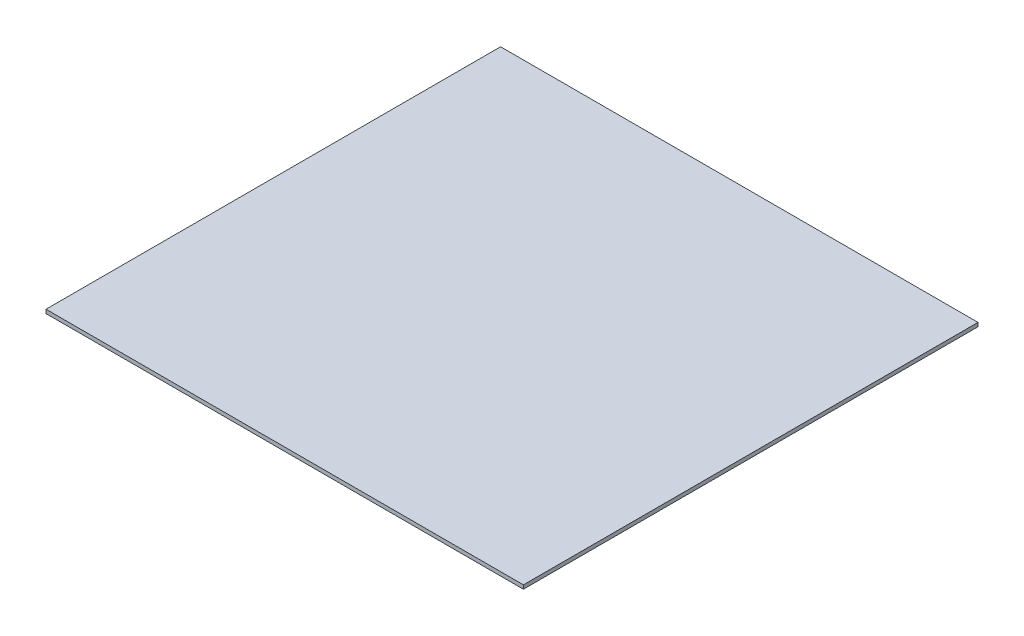
ISO-10303-21;
HEADER;
FILE_DESCRIPTION(('STEP AP214'),'2;1');
FILE_NAME('part.step','',(''),(''),'','','');
FILE_SCHEMA(('AUTOMOTIVE_DESIGN { 1 0 10303 214 1 1 1 1 }'));
ENDSEC;
DATA;
#1=APPLICATION_CONTEXT('core data for automotive mechanical design processes');
#2=APPLICATION_PROTOCOL_DEFINITION('international standard','automotive_design',2000,#1);
#3=PRODUCT_CONTEXT('',#1,'mechanical');
#4=PRODUCT('Part','Part','',(#3));
#5=PRODUCT_RELATED_PRODUCT_CATEGORY('part','',(#4));
#6=PRODUCT_DEFINITION_FORMATION('','',#4);
#7=PRODUCT_DEFINITION_CONTEXT('part definition',#1,'design');
#8=PRODUCT_DEFINITION('design','',#6,#7);
#9=PRODUCT_DEFINITION_SHAPE('','',#8);
#10=(LENGTH_UNIT() NAMED_UNIT(*) SI_UNIT(.MILLI.,.METRE.));
#11=(NAMED_UNIT(*) PLANE_ANGLE_UNIT() SI_UNIT($,.RADIAN.));
#12=(NAMED_UNIT(*) SI_UNIT($,.STERADIAN.) SOLID_ANGLE_UNIT());
#13=UNCERTAINTY_MEASURE_WITH_UNIT(LENGTH_MEASURE(1.E-05),#10,'distance_accuracy_value','');
#14=(GEOMETRIC_REPRESENTATION_CONTEXT(3) GLOBAL_UNCERTAINTY_ASSIGNED_CONTEXT((#13)) GLOBAL_UNIT_ASSIGNED_CONTEXT((#10,
#11,#12)) REPRESENTATION_CONTEXT('',''));
#15=CARTESIAN_POINT('',(0.,0.,0.));
#16=DIRECTION('',(0.,0.,1.));
#17=DIRECTION('',(1.,0.,0.));
#18=AXIS2_PLACEMENT_3D('',#15,#16,#17);
#19=CARTESIAN_POINT('',(-93.0917874396136,2.,-179.682367149758));
#20=DIRECTION('',(1.,0.,0.));
#21=DIRECTION('',(0.,0.,-1.));
#22=AXIS2_PLACEMENT_3D('',#19,#20,#21);
#23=PLANE('',#22);
#24=DIRECTION('',(0.,0.,1.));
#25=VECTOR('',#24,1.);
#26=CARTESIAN_POINT('',(-93.0917874396136,0.,-179.682367149758));
#27=LINE('',#26,#25);
#28=CARTESIAN_POINT('',(-93.0917874396136,0.,-179.682367149758));
#29=VERTEX_POINT('',#28);
#30=CARTESIAN_POINT('',(-93.0917874396135,0.,59.3176328502415));
#31=VERTEX_POINT('',#30);
#32=EDGE_CURVE('E113',#29,#31,#27,.T.);
#33=ORIENTED_EDGE('',*,*,#32,.T.);
#34=DIRECTION('',(0.,-1.,0.));
#35=VECTOR('',#34,1.);
#36=CARTESIAN_POINT('',(-93.0917874396135,2.,59.3176328502415));
#37=LINE('',#36,#35);
#38=CARTESIAN_POINT('',(-93.0917874396135,2.,59.3176328502415));
#39=VERTEX_POINT('',#38);
#40=EDGE_CURVE('E11',#39,#31,#37,.T.);
#41=ORIENTED_EDGE('',*,*,#40,.F.);
#42=DIRECTION('',(0.,0.,1.));
#43=VECTOR('',#42,1.);
#44=CARTESIAN_POINT('',(-93.0917874396136,2.,-179.682367149758));
#45=LINE('',#44,#43);
#46=CARTESIAN_POINT('',(-93.0917874396136,2.,-179.682367149758));
#47=VERTEX_POINT('',#46);
#48=EDGE_CURVE('E97',#47,#39,#45,.T.);
#49=ORIENTED_EDGE('',*,*,#48,.F.);
#50=DIRECTION('',(0.,-1.,0.));
#51=VECTOR('',#50,1.);
#52=CARTESIAN_POINT('',(-93.0917874396136,2.,-179.682367149758));
#53=LINE('',#52,#51);
#54=EDGE_CURVE('E109',#47,#29,#53,.T.);
#55=ORIENTED_EDGE('',*,*,#54,.T.);
#56=EDGE_LOOP('',(#33,#41,#49,#55));
#57=FACE_BOUND('',#56,.T.);
#58=ADVANCED_FACE('F45',(#57),#23,.F.);
#59=CARTESIAN_POINT('',(-93.0917874396135,2.,59.3176328502415));
#60=DIRECTION('',(0.,0.,-1.));
#61=DIRECTION('',(-1.,0.,0.));
#62=AXIS2_PLACEMENT_3D('',#59,#60,#61);
#63=PLANE('',#62);
#64=DIRECTION('',(1.,0.,0.));
#65=VECTOR('',#64,1.);
#66=CARTESIAN_POINT('',(-93.0917874396135,0.,59.3176328502415));
#67=LINE('',#66,#65);
#68=CARTESIAN_POINT('',(157.908212560386,0.,59.3176328502415));
#69=VERTEX_POINT('',#68);
#70=EDGE_CURVE('E102',#31,#69,#67,.T.);
#71=ORIENTED_EDGE('',*,*,#70,.T.);
#72=DIRECTION('',(0.,-1.,0.));
#73=VECTOR('',#72,1.);
#74=CARTESIAN_POINT('',(157.908212560386,2.,59.3176328502415));
#75=LINE('',#74,#73);
#76=CARTESIAN_POINT('',(157.908212560386,2.,59.3176328502415));
#77=VERTEX_POINT('',#76);
#78=EDGE_CURVE('E54',#77,#69,#75,.T.);
#79=ORIENTED_EDGE('',*,*,#78,.F.);
#80=DIRECTION('',(1.,0.,0.));
#81=VECTOR('',#80,1.);
#82=CARTESIAN_POINT('',(-93.0917874396135,2.,59.3176328502415));
#83=LINE('',#82,#81);
#84=EDGE_CURVE('E92',#39,#77,#83,.T.);
#85=ORIENTED_EDGE('',*,*,#84,.F.);
#86=ORIENTED_EDGE('',*,*,#40,.T.);
#87=EDGE_LOOP('',(#71,#79,#85,#86));
#88=FACE_BOUND('',#87,.T.);
#89=ADVANCED_FACE('F101',(#88),#63,.F.);
#90=CARTESIAN_POINT('',(157.908212560386,2.,-179.682367149758));
#91=DIRECTION('',(-1.,0.,0.));
#92=DIRECTION('',(0.,0.,1.));
#93=AXIS2_PLACEMENT_3D('',#90,#91,#92);
#94=PLANE('',#93);
#95=DIRECTION('',(0.,0.,-1.));
#96=VECTOR('',#95,1.);
#97=CARTESIAN_POINT('',(157.908212560386,0.,-179.682367149758));
#98=LINE('',#97,#96);
#99=CARTESIAN_POINT('',(157.908212560386,0.,-179.682367149758));
#100=VERTEX_POINT('',#99);
#101=EDGE_CURVE('E79',#69,#100,#98,.T.);
#102=ORIENTED_EDGE('',*,*,#101,.T.);
#103=DIRECTION('',(0.,-1.,0.));
#104=VECTOR('',#103,1.);
#105=CARTESIAN_POINT('',(157.908212560386,2.,-179.682367149758));
#106=LINE('',#105,#104);
#107=CARTESIAN_POINT('',(157.908212560386,2.,-179.682367149758));
#108=VERTEX_POINT('',#107);
#109=EDGE_CURVE('E104',#108,#100,#106,.T.);
#110=ORIENTED_EDGE('',*,*,#109,.F.);
#111=DIRECTION('',(0.,0.,-1.));
#112=VECTOR('',#111,1.);
#113=CARTESIAN_POINT('',(157.908212560386,2.,-179.682367149758));
#114=LINE('',#113,#112);
#115=EDGE_CURVE('E95',#77,#108,#114,.T.);
#116=ORIENTED_EDGE('',*,*,#115,.F.);
#117=ORIENTED_EDGE('',*,*,#78,.T.);
#118=EDGE_LOOP('',(#102,#110,#116,#117));
#119=FACE_BOUND('',#118,.T.);
#120=ADVANCED_FACE('F105',(#119),#94,.F.);
#121=CARTESIAN_POINT('',(-93.0917874396136,2.,-179.682367149758));
#122=DIRECTION('',(0.,0.,1.));
#123=DIRECTION('',(1.,0.,0.));
#124=AXIS2_PLACEMENT_3D('',#121,#122,#123);
#125=PLANE('',#124);
#126=DIRECTION('',(-1.,0.,0.));
#127=VECTOR('',#126,1.);
#128=CARTESIAN_POINT('',(-93.0917874396136,0.,-179.682367149758));
#129=LINE('',#128,#127);
#130=EDGE_CURVE('E85',#100,#29,#129,.T.);
#131=ORIENTED_EDGE('',*,*,#130,.T.);
#132=ORIENTED_EDGE('',*,*,#54,.F.);
#133=DIRECTION('',(-1.,0.,0.));
#134=VECTOR('',#133,1.);
#135=CARTESIAN_POINT('',(-93.0917874396136,2.,-179.682367149758));
#136=LINE('',#135,#134);
#137=EDGE_CURVE('E62',#108,#47,#136,.T.);
#138=ORIENTED_EDGE('',*,*,#137,.F.);
#139=ORIENTED_EDGE('',*,*,#109,.T.);
#140=EDGE_LOOP('',(#131,#132,#138,#139));
#141=FACE_BOUND('',#140,.T.);
#142=ADVANCED_FACE('F126',(#141),#125,.F.);
#143=CARTESIAN_POINT('',(0.,2.,0.));
#144=DIRECTION('',(0.,1.,0.));
#145=DIRECTION('',(0.,0.,1.));
#146=AXIS2_PLACEMENT_3D('',#143,#144,#145);
#147=PLANE('',#146);
#148=ORIENTED_EDGE('',*,*,#48,.T.);
#149=ORIENTED_EDGE('',*,*,#84,.T.);
#150=ORIENTED_EDGE('',*,*,#115,.T.);
#151=ORIENTED_EDGE('',*,*,#137,.T.);
#152=EDGE_LOOP('',(#148,#149,#150,#151));
#153=FACE_BOUND('',#152,.T.);
#154=ADVANCED_FACE('F93',(#153),#147,.T.);
#155=CARTESIAN_POINT('',(0.,0.,0.));
#156=DIRECTION('',(0.,1.,0.));
#157=DIRECTION('',(0.,0.,1.));
#158=AXIS2_PLACEMENT_3D('',#155,#156,#157);
#159=PLANE('',#158);
#160=ORIENTED_EDGE('',*,*,#32,.F.);
#161=ORIENTED_EDGE('',*,*,#130,.F.);
#162=ORIENTED_EDGE('',*,*,#101,.F.);
#163=ORIENTED_EDGE('',*,*,#70,.F.);
#164=EDGE_LOOP('',(#160,#161,#162,#163));
#165=FACE_BOUND('',#164,.T.);
#166=ADVANCED_FACE('F129',(#165),#159,.F.);
#167=CLOSED_SHELL('',(#58,#89,#120,#142,#154,#166));
#168=MANIFOLD_SOLID_BREP('B2',#167);
#169=ADVANCED_BREP_SHAPE_REPRESENTATION('',(#18,#168),#14);
#170=SHAPE_DEFINITION_REPRESENTATION(#9,#169);
ENDSEC;
END-ISO-10303-21;
